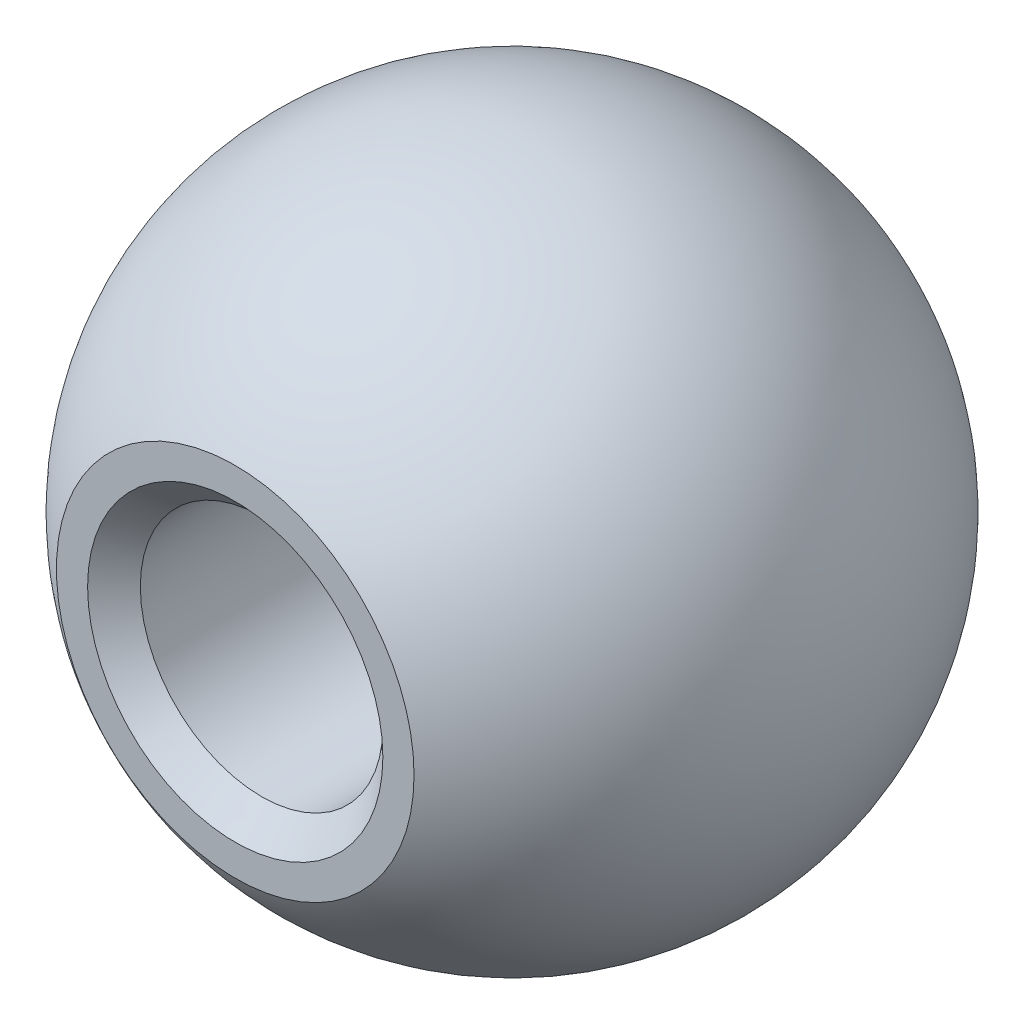
ISO-10303-21;
HEADER;
FILE_DESCRIPTION(('STEP AP214'),'2;1');
FILE_NAME('part.step','',(''),(''),'','','');
FILE_SCHEMA(('AUTOMOTIVE_DESIGN { 1 0 10303 214 1 1 1 1 }'));
ENDSEC;
DATA;
#1=APPLICATION_CONTEXT('core data for automotive mechanical design processes');
#2=APPLICATION_PROTOCOL_DEFINITION('international standard','automotive_design',2000,#1);
#3=PRODUCT_CONTEXT('',#1,'mechanical');
#4=PRODUCT('Part','Part','',(#3));
#5=PRODUCT_RELATED_PRODUCT_CATEGORY('part','',(#4));
#6=PRODUCT_DEFINITION_FORMATION('','',#4);
#7=PRODUCT_DEFINITION_CONTEXT('part definition',#1,'design');
#8=PRODUCT_DEFINITION('design','',#6,#7);
#9=PRODUCT_DEFINITION_SHAPE('','',#8);
#10=(LENGTH_UNIT() NAMED_UNIT(*) SI_UNIT(.MILLI.,.METRE.));
#11=(NAMED_UNIT(*) PLANE_ANGLE_UNIT() SI_UNIT($,.RADIAN.));
#12=(NAMED_UNIT(*) SI_UNIT($,.STERADIAN.) SOLID_ANGLE_UNIT());
#13=UNCERTAINTY_MEASURE_WITH_UNIT(LENGTH_MEASURE(1.E-05),#10,'distance_accuracy_value','');
#14=(GEOMETRIC_REPRESENTATION_CONTEXT(3) GLOBAL_UNCERTAINTY_ASSIGNED_CONTEXT((#13)) GLOBAL_UNIT_ASSIGNED_CONTEXT((#10,
#11,#12)) REPRESENTATION_CONTEXT('',''));
#15=CARTESIAN_POINT('',(0.,0.,0.));
#16=DIRECTION('',(0.,0.,1.));
#17=DIRECTION('',(1.,0.,0.));
#18=AXIS2_PLACEMENT_3D('',#15,#16,#17);
#19=CARTESIAN_POINT('',(0.,0.,0.));
#20=DIRECTION('',(0.,1.,0.));
#21=DIRECTION('',(1.,0.,0.));
#22=AXIS2_PLACEMENT_3D('',#19,#20,#21);
#23=SPHERICAL_SURFACE('',#22,12.5);
#24=CARTESIAN_POINT('',(0.,0.,0.));
#25=DIRECTION('',(0.,0.,1.));
#26=DIRECTION('',(1.,0.,0.));
#27=AXIS2_PLACEMENT_3D('',#24,#25,#26);
#28=SPHERICAL_SURFACE('',#27,12.5);
#29=CARTESIAN_POINT('',(0.,0.,10.5));
#30=DIRECTION('',(0.,0.,1.));
#31=DIRECTION('',(1.,0.,0.));
#32=AXIS2_PLACEMENT_3D('',#29,#30,#31);
#33=CIRCLE('',#32,6.78232998312527);
#34=CARTESIAN_POINT('',(6.78232998312527,0.,10.5));
#35=VERTEX_POINT('',#34);
#36=EDGE_CURVE('E59',#35,#35,#33,.F.);
#37=ORIENTED_EDGE('',*,*,#36,.T.);
#38=EDGE_LOOP('',(#37));
#39=FACE_BOUND('',#38,.T.);
#40=ADVANCED_FACE('F39',(#39),#28,.T.);
#41=CARTESIAN_POINT('',(0.,0.,10.5));
#42=DIRECTION('',(0.,0.,1.));
#43=DIRECTION('',(1.,0.,0.));
#44=AXIS2_PLACEMENT_3D('',#41,#42,#43);
#45=PLANE('',#44);
#46=CARTESIAN_POINT('',(0.,0.,10.5));
#47=DIRECTION('',(0.,0.,1.));
#48=DIRECTION('',(1.,0.,0.));
#49=AXIS2_PLACEMENT_3D('',#46,#47,#48);
#50=CIRCLE('',#49,5.60000000000001);
#51=CARTESIAN_POINT('',(5.60000000000001,0.,10.5));
#52=VERTEX_POINT('',#51);
#53=EDGE_CURVE('E11',#52,#52,#50,.F.);
#54=ORIENTED_EDGE('',*,*,#53,.T.);
#55=EDGE_LOOP('',(#54));
#56=FACE_BOUND('',#55,.T.);
#57=ORIENTED_EDGE('',*,*,#36,.F.);
#58=EDGE_LOOP('',(#57));
#59=FACE_BOUND('',#58,.T.);
#60=ADVANCED_FACE('F53',(#56,#59),#45,.T.);
#61=CARTESIAN_POINT('',(0.,0.,-1.5));
#62=DIRECTION('',(0.,0.,1.));
#63=DIRECTION('',(1.,0.,0.));
#64=AXIS2_PLACEMENT_3D('',#61,#62,#63);
#65=CONICAL_SURFACE('',#64,4.6,1.02974425867665);
#66=CARTESIAN_POINT('',(0.,0.,-4.26395884752678));
#67=VERTEX_POINT('',#66);
#68=VERTEX_LOOP('',#67);
#69=FACE_BOUND('',#68,.T.);
#70=CARTESIAN_POINT('',(0.,0.,-1.5));
#71=DIRECTION('',(0.,0.,1.));
#72=DIRECTION('',(1.,0.,0.));
#73=AXIS2_PLACEMENT_3D('',#70,#71,#72);
#74=CIRCLE('',#73,4.6);
#75=CARTESIAN_POINT('',(4.6,0.,-1.5));
#76=VERTEX_POINT('',#75);
#77=EDGE_CURVE('E57',#76,#76,#74,.T.);
#78=ORIENTED_EDGE('',*,*,#77,.T.);
#79=EDGE_LOOP('',(#78));
#80=FACE_BOUND('',#79,.T.);
#81=ADVANCED_FACE('F49',(#69,#80),#65,.F.);
#82=CARTESIAN_POINT('',(0.,0.,10.5));
#83=DIRECTION('',(0.,0.,1.));
#84=DIRECTION('',(1.,0.,0.));
#85=AXIS2_PLACEMENT_3D('',#82,#83,#84);
#86=CYLINDRICAL_SURFACE('',#85,4.6);
#87=CARTESIAN_POINT('',(0.,0.,9.49999999999999));
#88=DIRECTION('',(0.,0.,1.));
#89=DIRECTION('',(1.,0.,0.));
#90=AXIS2_PLACEMENT_3D('',#87,#88,#89);
#91=CIRCLE('',#90,4.6);
#92=CARTESIAN_POINT('',(4.6,0.,9.49999999999999));
#93=VERTEX_POINT('',#92);
#94=EDGE_CURVE('E46',#93,#93,#91,.T.);
#95=ORIENTED_EDGE('',*,*,#94,.T.);
#96=EDGE_LOOP('',(#95));
#97=FACE_BOUND('',#96,.T.);
#98=ORIENTED_EDGE('',*,*,#77,.F.);
#99=EDGE_LOOP('',(#98));
#100=FACE_BOUND('',#99,.T.);
#101=ADVANCED_FACE('F52',(#97,#100),#86,.F.);
#102=CARTESIAN_POINT('',(0.,0.,9.49999999999999));
#103=DIRECTION('',(0.,0.,1.));
#104=DIRECTION('',(1.,0.,0.));
#105=AXIS2_PLACEMENT_3D('',#102,#103,#104);
#106=CONICAL_SURFACE('',#105,4.6,0.785398163397453);
#107=ORIENTED_EDGE('',*,*,#53,.F.);
#108=EDGE_LOOP('',(#107));
#109=FACE_BOUND('',#108,.T.);
#110=ORIENTED_EDGE('',*,*,#94,.F.);
#111=EDGE_LOOP('',(#110));
#112=FACE_BOUND('',#111,.T.);
#113=ADVANCED_FACE('F41',(#109,#112),#106,.F.);
#114=CLOSED_SHELL('',(#40,#60,#81,#101,#113));
#115=MANIFOLD_SOLID_BREP('B2',#114);
#116=ADVANCED_BREP_SHAPE_REPRESENTATION('',(#18,#115),#14);
#117=SHAPE_DEFINITION_REPRESENTATION(#9,#116);
ENDSEC;
END-ISO-10303-21;
